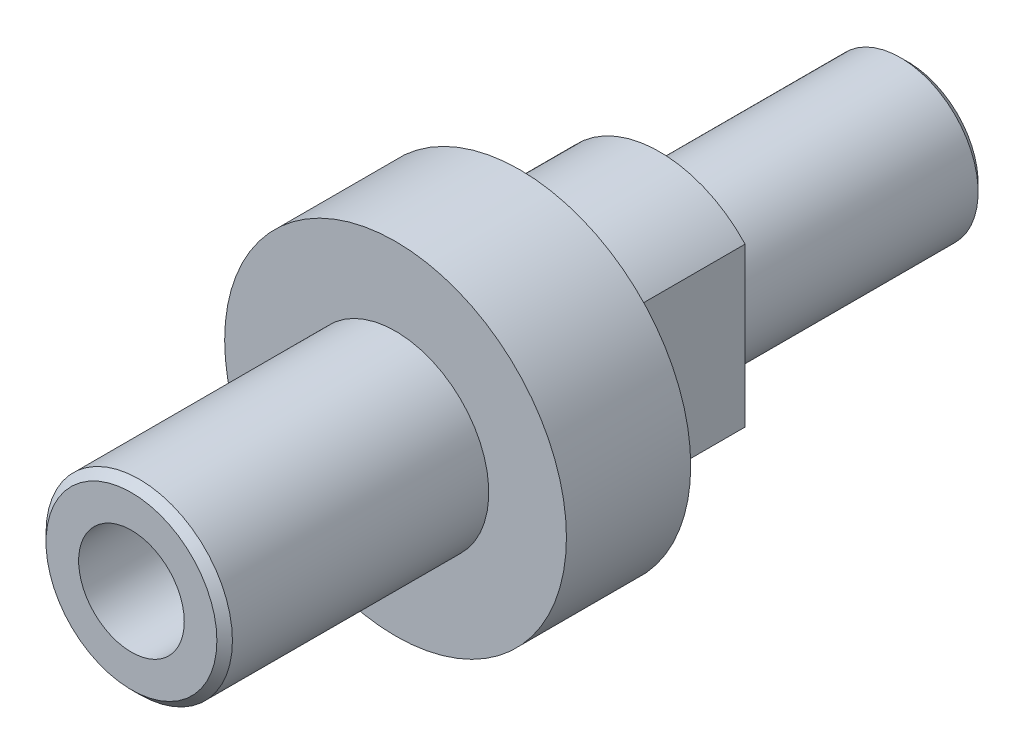
ISO-10303-21;
HEADER;
FILE_DESCRIPTION(('STEP AP214'),'2;1');
FILE_NAME('part.step','',(''),(''),'','','');
FILE_SCHEMA(('AUTOMOTIVE_DESIGN { 1 0 10303 214 1 1 1 1 }'));
ENDSEC;
DATA;
#1=APPLICATION_CONTEXT('core data for automotive mechanical design processes');
#2=APPLICATION_PROTOCOL_DEFINITION('international standard','automotive_design',2000,#1);
#3=PRODUCT_CONTEXT('',#1,'mechanical');
#4=PRODUCT('Part','Part','',(#3));
#5=PRODUCT_RELATED_PRODUCT_CATEGORY('part','',(#4));
#6=PRODUCT_DEFINITION_FORMATION('','',#4);
#7=PRODUCT_DEFINITION_CONTEXT('part definition',#1,'design');
#8=PRODUCT_DEFINITION('design','',#6,#7);
#9=PRODUCT_DEFINITION_SHAPE('','',#8);
#10=(LENGTH_UNIT() NAMED_UNIT(*) SI_UNIT(.MILLI.,.METRE.));
#11=(NAMED_UNIT(*) PLANE_ANGLE_UNIT() SI_UNIT($,.RADIAN.));
#12=(NAMED_UNIT(*) SI_UNIT($,.STERADIAN.) SOLID_ANGLE_UNIT());
#13=UNCERTAINTY_MEASURE_WITH_UNIT(LENGTH_MEASURE(1.E-05),#10,'distance_accuracy_value','');
#14=(GEOMETRIC_REPRESENTATION_CONTEXT(3) GLOBAL_UNCERTAINTY_ASSIGNED_CONTEXT((#13)) GLOBAL_UNIT_ASSIGNED_CONTEXT((#10,
#11,#12)) REPRESENTATION_CONTEXT('',''));
#15=CARTESIAN_POINT('',(0.,0.,0.));
#16=DIRECTION('',(0.,0.,1.));
#17=DIRECTION('',(1.,0.,0.));
#18=AXIS2_PLACEMENT_3D('',#15,#16,#17);
#19=CARTESIAN_POINT('',(0.,0.,-50.));
#20=DIRECTION('',(0.,0.,-1.));
#21=DIRECTION('',(-1.,0.,0.));
#22=AXIS2_PLACEMENT_3D('',#19,#20,#21);
#23=CYLINDRICAL_SURFACE('',#22,7.5);
#24=DIRECTION('',(0.,0.,-1.));
#25=VECTOR('',#24,1.);
#26=CARTESIAN_POINT('',(-5.5,-5.09901951359278,-50.));
#27=LINE('',#26,#25);
#28=CARTESIAN_POINT('',(-5.5,-5.09901951359278,-34.));
#29=VERTEX_POINT('',#28);
#30=CARTESIAN_POINT('',(-5.5,-5.09901951359278,-25.));
#31=VERTEX_POINT('',#30);
#32=EDGE_CURVE('E102',#29,#31,#27,.F.);
#33=ORIENTED_EDGE('',*,*,#32,.F.);
#34=CARTESIAN_POINT('',(0.,0.,-34.));
#35=DIRECTION('',(0.,0.,-1.));
#36=DIRECTION('',(-1.,0.,0.));
#37=AXIS2_PLACEMENT_3D('',#34,#35,#36);
#38=CIRCLE('',#37,7.5);
#39=CARTESIAN_POINT('',(5.5,-5.09901951359278,-34.));
#40=VERTEX_POINT('',#39);
#41=EDGE_CURVE('E107',#40,#29,#38,.T.);
#42=ORIENTED_EDGE('',*,*,#41,.F.);
#43=DIRECTION('',(0.,0.,-1.));
#44=VECTOR('',#43,1.);
#45=CARTESIAN_POINT('',(5.5,-5.09901951359278,-50.));
#46=LINE('',#45,#44);
#47=CARTESIAN_POINT('',(5.5,-5.09901951359278,-25.));
#48=VERTEX_POINT('',#47);
#49=EDGE_CURVE('E52',#48,#40,#46,.T.);
#50=ORIENTED_EDGE('',*,*,#49,.F.);
#51=CARTESIAN_POINT('',(0.,0.,-25.));
#52=DIRECTION('',(0.,0.,-1.));
#53=DIRECTION('',(-1.,0.,0.));
#54=AXIS2_PLACEMENT_3D('',#51,#52,#53);
#55=CIRCLE('',#54,7.5);
#56=EDGE_CURVE('E111',#48,#31,#55,.T.);
#57=ORIENTED_EDGE('',*,*,#56,.T.);
#58=EDGE_LOOP('',(#33,#42,#50,#57));
#59=FACE_BOUND('',#58,.T.);
#60=ADVANCED_FACE('F37',(#59),#23,.T.);
#61=CARTESIAN_POINT('',(0.,0.,0.));
#62=DIRECTION('',(0.,0.,1.));
#63=DIRECTION('',(1.,0.,0.));
#64=AXIS2_PLACEMENT_3D('',#61,#62,#63);
#65=PLANE('',#64);
#66=CARTESIAN_POINT('',(0.,0.,0.));
#67=DIRECTION('',(0.,0.,1.));
#68=DIRECTION('',(1.,0.,0.));
#69=AXIS2_PLACEMENT_3D('',#66,#67,#68);
#70=CIRCLE('',#69,5.50000000000001);
#71=CARTESIAN_POINT('',(5.50000000000001,0.,0.));
#72=VERTEX_POINT('',#71);
#73=EDGE_CURVE('E12',#72,#72,#70,.T.);
#74=ORIENTED_EDGE('',*,*,#73,.T.);
#75=EDGE_LOOP('',(#74));
#76=FACE_BOUND('',#75,.T.);
#77=CARTESIAN_POINT('',(0.,0.,0.));
#78=DIRECTION('',(0.,0.,1.));
#79=DIRECTION('',(1.,0.,0.));
#80=AXIS2_PLACEMENT_3D('',#77,#78,#79);
#81=CIRCLE('',#80,3.4);
#82=CARTESIAN_POINT('',(3.4,0.,0.));
#83=VERTEX_POINT('',#82);
#84=EDGE_CURVE('E90',#83,#83,#81,.T.);
#85=ORIENTED_EDGE('',*,*,#84,.F.);
#86=EDGE_LOOP('',(#85));
#87=FACE_BOUND('',#86,.T.);
#88=ADVANCED_FACE('F148',(#76,#87),#65,.T.);
#89=CARTESIAN_POINT('',(0.,0.,-50.));
#90=DIRECTION('',(0.,0.,-1.));
#91=DIRECTION('',(-1.,0.,0.));
#92=AXIS2_PLACEMENT_3D('',#89,#90,#91);
#93=CYLINDRICAL_SURFACE('',#92,6.);
#94=CARTESIAN_POINT('',(0.,0.,-0.499999999999987));
#95=DIRECTION('',(0.,0.,1.));
#96=DIRECTION('',(1.,0.,0.));
#97=AXIS2_PLACEMENT_3D('',#94,#95,#96);
#98=CIRCLE('',#97,6.);
#99=CARTESIAN_POINT('',(6.,0.,-0.499999999999987));
#100=VERTEX_POINT('',#99);
#101=EDGE_CURVE('E45',#100,#100,#98,.F.);
#102=ORIENTED_EDGE('',*,*,#101,.T.);
#103=EDGE_LOOP('',(#102));
#104=FACE_BOUND('',#103,.T.);
#105=CARTESIAN_POINT('',(0.,0.,-17.));
#106=DIRECTION('',(0.,0.,-1.));
#107=DIRECTION('',(-1.,0.,0.));
#108=AXIS2_PLACEMENT_3D('',#105,#106,#107);
#109=CIRCLE('',#108,6.);
#110=CARTESIAN_POINT('',(-6.,0.,-17.));
#111=VERTEX_POINT('',#110);
#112=EDGE_CURVE('E121',#111,#111,#109,.T.);
#113=ORIENTED_EDGE('',*,*,#112,.F.);
#114=EDGE_LOOP('',(#113));
#115=FACE_BOUND('',#114,.T.);
#116=ADVANCED_FACE('F136',(#104,#115),#93,.T.);
#117=CARTESIAN_POINT('',(0.,6.,-17.));
#118=DIRECTION('',(0.,0.,1.));
#119=DIRECTION('',(1.,0.,0.));
#120=AXIS2_PLACEMENT_3D('',#117,#118,#119);
#121=PLANE('',#120);
#122=ORIENTED_EDGE('',*,*,#112,.T.);
#123=EDGE_LOOP('',(#122));
#124=FACE_BOUND('',#123,.T.);
#125=CARTESIAN_POINT('',(0.,0.,-17.));
#126=DIRECTION('',(0.,0.,-1.));
#127=DIRECTION('',(-1.,0.,0.));
#128=AXIS2_PLACEMENT_3D('',#125,#126,#127);
#129=CIRCLE('',#128,11.);
#130=CARTESIAN_POINT('',(-11.,0.,-17.));
#131=VERTEX_POINT('',#130);
#132=EDGE_CURVE('E118',#131,#131,#129,.T.);
#133=ORIENTED_EDGE('',*,*,#132,.F.);
#134=EDGE_LOOP('',(#133));
#135=FACE_BOUND('',#134,.T.);
#136=ADVANCED_FACE('F253',(#124,#135),#121,.T.);
#137=CARTESIAN_POINT('',(0.,0.,-50.));
#138=DIRECTION('',(0.,0.,-1.));
#139=DIRECTION('',(-1.,0.,0.));
#140=AXIS2_PLACEMENT_3D('',#137,#138,#139);
#141=CYLINDRICAL_SURFACE('',#140,11.);
#142=ORIENTED_EDGE('',*,*,#132,.T.);
#143=EDGE_LOOP('',(#142));
#144=FACE_BOUND('',#143,.T.);
#145=CARTESIAN_POINT('',(0.,0.,-25.));
#146=DIRECTION('',(0.,0.,-1.));
#147=DIRECTION('',(-1.,0.,0.));
#148=AXIS2_PLACEMENT_3D('',#145,#146,#147);
#149=CIRCLE('',#148,11.);
#150=CARTESIAN_POINT('',(-11.,0.,-25.));
#151=VERTEX_POINT('',#150);
#152=EDGE_CURVE('E115',#151,#151,#149,.T.);
#153=ORIENTED_EDGE('',*,*,#152,.F.);
#154=EDGE_LOOP('',(#153));
#155=FACE_BOUND('',#154,.T.);
#156=ADVANCED_FACE('F170',(#144,#155),#141,.T.);
#157=CARTESIAN_POINT('',(0.,11.,-25.));
#158=DIRECTION('',(0.,0.,-1.));
#159=DIRECTION('',(-1.,0.,0.));
#160=AXIS2_PLACEMENT_3D('',#157,#158,#159);
#161=PLANE('',#160);
#162=CARTESIAN_POINT('',(-5.5,5.09901951359278,-25.));
#163=VERTEX_POINT('',#162);
#164=CARTESIAN_POINT('',(5.5,5.09901951359278,-25.));
#165=VERTEX_POINT('',#164);
#166=EDGE_CURVE('E112',#163,#165,#55,.T.);
#167=ORIENTED_EDGE('',*,*,#166,.F.);
#168=DIRECTION('',(0.,1.,0.));
#169=VECTOR('',#168,1.);
#170=CARTESIAN_POINT('',(-5.5,8.58517698639783,-25.));
#171=LINE('',#170,#169);
#172=EDGE_CURVE('E89',#31,#163,#171,.T.);
#173=ORIENTED_EDGE('',*,*,#172,.F.);
#174=ORIENTED_EDGE('',*,*,#56,.F.);
#175=DIRECTION('',(0.,-1.,0.));
#176=VECTOR('',#175,1.);
#177=CARTESIAN_POINT('',(5.5,8.58517698639783,-25.));
#178=LINE('',#177,#176);
#179=EDGE_CURVE('E92',#165,#48,#178,.T.);
#180=ORIENTED_EDGE('',*,*,#179,.F.);
#181=EDGE_LOOP('',(#167,#173,#174,#180));
#182=FACE_BOUND('',#181,.T.);
#183=ORIENTED_EDGE('',*,*,#152,.T.);
#184=EDGE_LOOP('',(#183));
#185=FACE_BOUND('',#184,.T.);
#186=ADVANCED_FACE('F162',(#182,#185),#161,.T.);
#187=DIRECTION('',(0.,0.,-1.));
#188=VECTOR('',#187,1.);
#189=CARTESIAN_POINT('',(-5.5,5.09901951359278,-50.));
#190=LINE('',#189,#188);
#191=CARTESIAN_POINT('',(-5.5,5.09901951359278,-34.));
#192=VERTEX_POINT('',#191);
#193=EDGE_CURVE('E60',#163,#192,#190,.T.);
#194=ORIENTED_EDGE('',*,*,#193,.F.);
#195=ORIENTED_EDGE('',*,*,#166,.T.);
#196=DIRECTION('',(0.,0.,-1.));
#197=VECTOR('',#196,1.);
#198=CARTESIAN_POINT('',(5.5,5.09901951359278,-50.));
#199=LINE('',#198,#197);
#200=CARTESIAN_POINT('',(5.5,5.09901951359278,-34.));
#201=VERTEX_POINT('',#200);
#202=EDGE_CURVE('E99',#201,#165,#199,.F.);
#203=ORIENTED_EDGE('',*,*,#202,.F.);
#204=EDGE_CURVE('E108',#192,#201,#38,.T.);
#205=ORIENTED_EDGE('',*,*,#204,.F.);
#206=EDGE_LOOP('',(#194,#195,#203,#205));
#207=FACE_BOUND('',#206,.T.);
#208=ADVANCED_FACE('F151',(#207),#23,.T.);
#209=CARTESIAN_POINT('',(0.,7.5,-34.));
#210=DIRECTION('',(0.,0.,-1.));
#211=DIRECTION('',(-1.,0.,0.));
#212=AXIS2_PLACEMENT_3D('',#209,#210,#211);
#213=PLANE('',#212);
#214=DIRECTION('',(0.,-1.,0.));
#215=VECTOR('',#214,1.);
#216=CARTESIAN_POINT('',(-5.5,7.49999999999999,-34.));
#217=LINE('',#216,#215);
#218=EDGE_CURVE('E126',#192,#29,#217,.T.);
#219=ORIENTED_EDGE('',*,*,#218,.F.);
#220=ORIENTED_EDGE('',*,*,#204,.T.);
#221=DIRECTION('',(0.,1.,0.));
#222=VECTOR('',#221,1.);
#223=CARTESIAN_POINT('',(5.5,7.49999999999999,-34.));
#224=LINE('',#223,#222);
#225=EDGE_CURVE('E124',#40,#201,#224,.T.);
#226=ORIENTED_EDGE('',*,*,#225,.F.);
#227=ORIENTED_EDGE('',*,*,#41,.T.);
#228=EDGE_LOOP('',(#219,#220,#226,#227));
#229=FACE_BOUND('',#228,.T.);
#230=CARTESIAN_POINT('',(0.,0.,-34.));
#231=DIRECTION('',(0.,0.,-1.));
#232=DIRECTION('',(-1.,0.,0.));
#233=AXIS2_PLACEMENT_3D('',#230,#231,#232);
#234=CIRCLE('',#233,5.);
#235=CARTESIAN_POINT('',(-5.,0.,-34.));
#236=VERTEX_POINT('',#235);
#237=EDGE_CURVE('E104',#236,#236,#234,.T.);
#238=ORIENTED_EDGE('',*,*,#237,.F.);
#239=EDGE_LOOP('',(#238));
#240=FACE_BOUND('',#239,.T.);
#241=ADVANCED_FACE('F161',(#229,#240),#213,.T.);
#242=CARTESIAN_POINT('',(0.,0.,-50.));
#243=DIRECTION('',(0.,0.,-1.));
#244=DIRECTION('',(-1.,0.,0.));
#245=AXIS2_PLACEMENT_3D('',#242,#243,#244);
#246=CYLINDRICAL_SURFACE('',#245,5.);
#247=CARTESIAN_POINT('',(0.,0.,-49.5));
#248=DIRECTION('',(0.,0.,-1.));
#249=DIRECTION('',(-1.,0.,0.));
#250=AXIS2_PLACEMENT_3D('',#247,#248,#249);
#251=CIRCLE('',#250,5.);
#252=CARTESIAN_POINT('',(-5.,0.,-49.5));
#253=VERTEX_POINT('',#252);
#254=EDGE_CURVE('E131',#253,#253,#251,.F.);
#255=ORIENTED_EDGE('',*,*,#254,.T.);
#256=EDGE_LOOP('',(#255));
#257=FACE_BOUND('',#256,.T.);
#258=ORIENTED_EDGE('',*,*,#237,.T.);
#259=EDGE_LOOP('',(#258));
#260=FACE_BOUND('',#259,.T.);
#261=ADVANCED_FACE('F168',(#257,#260),#246,.T.);
#262=CARTESIAN_POINT('',(0.,5.,-50.));
#263=DIRECTION('',(0.,0.,-1.));
#264=DIRECTION('',(-1.,0.,0.));
#265=AXIS2_PLACEMENT_3D('',#262,#263,#264);
#266=PLANE('',#265);
#267=CARTESIAN_POINT('',(0.,0.,-50.));
#268=DIRECTION('',(0.,0.,-1.));
#269=DIRECTION('',(-1.,0.,0.));
#270=AXIS2_PLACEMENT_3D('',#267,#268,#269);
#271=CIRCLE('',#270,4.5);
#272=CARTESIAN_POINT('',(-4.5,0.,-50.));
#273=VERTEX_POINT('',#272);
#274=EDGE_CURVE('E128',#273,#273,#271,.T.);
#275=ORIENTED_EDGE('',*,*,#274,.T.);
#276=EDGE_LOOP('',(#275));
#277=FACE_BOUND('',#276,.T.);
#278=ADVANCED_FACE('F189',(#277),#266,.T.);
#279=CARTESIAN_POINT('',(5.5,8.58517698639783,6.42382535593017));
#280=DIRECTION('',(-1.,0.,0.));
#281=DIRECTION('',(0.,-1.,0.));
#282=AXIS2_PLACEMENT_3D('',#279,#280,#281);
#283=PLANE('',#282);
#284=ORIENTED_EDGE('',*,*,#202,.T.);
#285=ORIENTED_EDGE('',*,*,#179,.T.);
#286=ORIENTED_EDGE('',*,*,#49,.T.);
#287=ORIENTED_EDGE('',*,*,#225,.T.);
#288=EDGE_LOOP('',(#284,#285,#286,#287));
#289=FACE_BOUND('',#288,.T.);
#290=ADVANCED_FACE('F180',(#289),#283,.F.);
#291=CARTESIAN_POINT('',(-5.5,8.58517698639783,6.42382535593017));
#292=DIRECTION('',(1.,0.,0.));
#293=DIRECTION('',(0.,1.,0.));
#294=AXIS2_PLACEMENT_3D('',#291,#292,#293);
#295=PLANE('',#294);
#296=ORIENTED_EDGE('',*,*,#32,.T.);
#297=ORIENTED_EDGE('',*,*,#172,.T.);
#298=ORIENTED_EDGE('',*,*,#193,.T.);
#299=ORIENTED_EDGE('',*,*,#218,.T.);
#300=EDGE_LOOP('',(#296,#297,#298,#299));
#301=FACE_BOUND('',#300,.T.);
#302=ADVANCED_FACE('F83',(#301),#295,.F.);
#303=CARTESIAN_POINT('',(0.,0.,-19.75));
#304=DIRECTION('',(0.,0.,1.));
#305=DIRECTION('',(1.,0.,0.));
#306=AXIS2_PLACEMENT_3D('',#303,#304,#305);
#307=CONICAL_SURFACE('',#306,3.4,1.02974425867665);
#308=CARTESIAN_POINT('',(0.,0.,-21.7929261046937));
#309=VERTEX_POINT('',#308);
#310=VERTEX_LOOP('',#309);
#311=FACE_BOUND('',#310,.T.);
#312=CARTESIAN_POINT('',(0.,0.,-19.75));
#313=DIRECTION('',(0.,0.,1.));
#314=DIRECTION('',(1.,0.,0.));
#315=AXIS2_PLACEMENT_3D('',#312,#313,#314);
#316=CIRCLE('',#315,3.4);
#317=CARTESIAN_POINT('',(3.4,0.,-19.75));
#318=VERTEX_POINT('',#317);
#319=EDGE_CURVE('E87',#318,#318,#316,.T.);
#320=ORIENTED_EDGE('',*,*,#319,.T.);
#321=EDGE_LOOP('',(#320));
#322=FACE_BOUND('',#321,.T.);
#323=ADVANCED_FACE('F79',(#311,#322),#307,.F.);
#324=CARTESIAN_POINT('',(0.,0.,0.));
#325=DIRECTION('',(0.,0.,1.));
#326=DIRECTION('',(1.,0.,0.));
#327=AXIS2_PLACEMENT_3D('',#324,#325,#326);
#328=CYLINDRICAL_SURFACE('',#327,3.4);
#329=ORIENTED_EDGE('',*,*,#319,.F.);
#330=EDGE_LOOP('',(#329));
#331=FACE_BOUND('',#330,.T.);
#332=ORIENTED_EDGE('',*,*,#84,.T.);
#333=EDGE_LOOP('',(#332));
#334=FACE_BOUND('',#333,.T.);
#335=ADVANCED_FACE('F82',(#331,#334),#328,.F.);
#336=CARTESIAN_POINT('',(0.,0.,-50.));
#337=DIRECTION('',(0.,0.,1.));
#338=DIRECTION('',(1.,0.,0.));
#339=AXIS2_PLACEMENT_3D('',#336,#337,#338);
#340=CONICAL_SURFACE('',#339,4.5,0.785398163397443);
#341=ORIENTED_EDGE('',*,*,#254,.F.);
#342=EDGE_LOOP('',(#341));
#343=FACE_BOUND('',#342,.T.);
#344=ORIENTED_EDGE('',*,*,#274,.F.);
#345=EDGE_LOOP('',(#344));
#346=FACE_BOUND('',#345,.T.);
#347=ADVANCED_FACE('F140',(#343,#346),#340,.T.);
#348=CARTESIAN_POINT('',(0.,0.,-0.499999999999987));
#349=DIRECTION('',(0.,0.,-1.));
#350=DIRECTION('',(-1.,0.,0.));
#351=AXIS2_PLACEMENT_3D('',#348,#349,#350);
#352=CONICAL_SURFACE('',#351,6.,0.785398163397449);
#353=ORIENTED_EDGE('',*,*,#73,.F.);
#354=EDGE_LOOP('',(#353));
#355=FACE_BOUND('',#354,.T.);
#356=ORIENTED_EDGE('',*,*,#101,.F.);
#357=EDGE_LOOP('',(#356));
#358=FACE_BOUND('',#357,.T.);
#359=ADVANCED_FACE('F39',(#355,#358),#352,.T.);
#360=CLOSED_SHELL('',(#60,#88,#116,#136,#156,#186,#208,#241,#261,#278,#290,#302,#323,#335,#347,#359));
#361=MANIFOLD_SOLID_BREP('B2',#360);
#362=ADVANCED_BREP_SHAPE_REPRESENTATION('',(#18,#361),#14);
#363=SHAPE_DEFINITION_REPRESENTATION(#9,#362);
ENDSEC;
END-ISO-10303-21;
